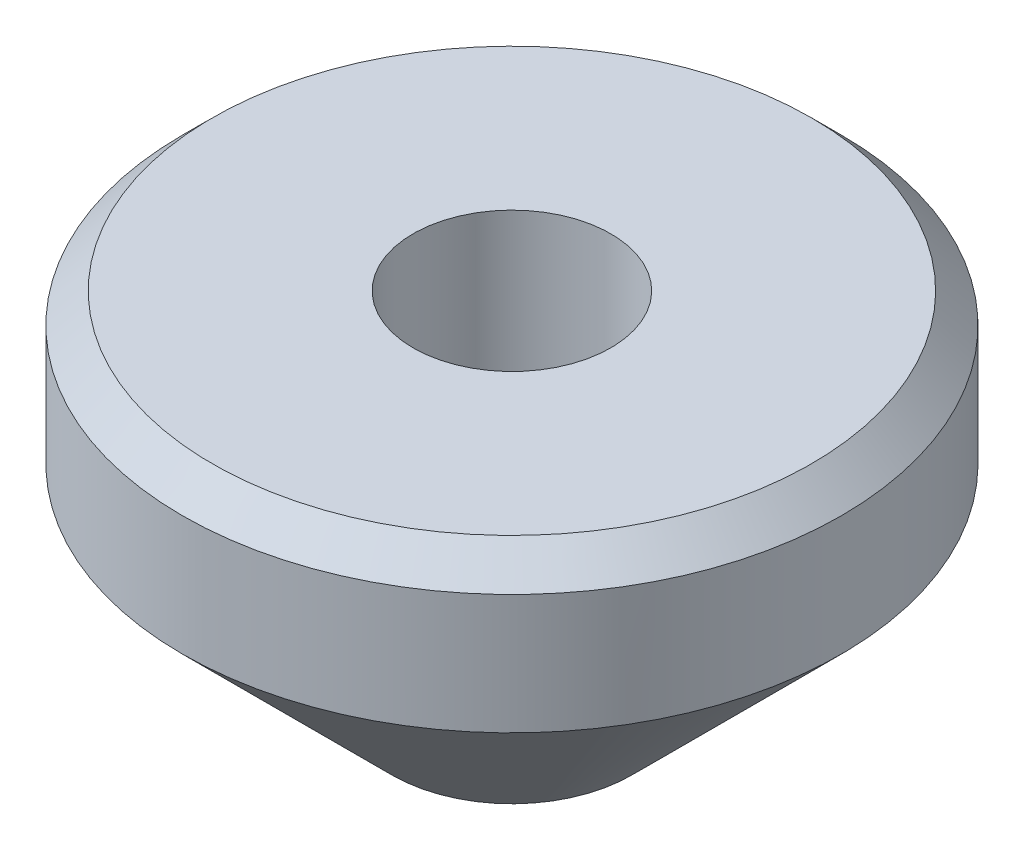
ISO-10303-21;
HEADER;
FILE_DESCRIPTION(('STEP AP214'),'2;1');
FILE_NAME('part.step','',(''),(''),'','','');
FILE_SCHEMA(('AUTOMOTIVE_DESIGN { 1 0 10303 214 1 1 1 1 }'));
ENDSEC;
DATA;
#1=APPLICATION_CONTEXT('core data for automotive mechanical design processes');
#2=APPLICATION_PROTOCOL_DEFINITION('international standard','automotive_design',2000,#1);
#3=PRODUCT_CONTEXT('',#1,'mechanical');
#4=PRODUCT('Part','Part','',(#3));
#5=PRODUCT_RELATED_PRODUCT_CATEGORY('part','',(#4));
#6=PRODUCT_DEFINITION_FORMATION('','',#4);
#7=PRODUCT_DEFINITION_CONTEXT('part definition',#1,'design');
#8=PRODUCT_DEFINITION('design','',#6,#7);
#9=PRODUCT_DEFINITION_SHAPE('','',#8);
#10=(LENGTH_UNIT() NAMED_UNIT(*) SI_UNIT(.MILLI.,.METRE.));
#11=(NAMED_UNIT(*) PLANE_ANGLE_UNIT() SI_UNIT($,.RADIAN.));
#12=(NAMED_UNIT(*) SI_UNIT($,.STERADIAN.) SOLID_ANGLE_UNIT());
#13=UNCERTAINTY_MEASURE_WITH_UNIT(LENGTH_MEASURE(1.E-05),#10,'distance_accuracy_value','');
#14=(GEOMETRIC_REPRESENTATION_CONTEXT(3) GLOBAL_UNCERTAINTY_ASSIGNED_CONTEXT((#13)) GLOBAL_UNIT_ASSIGNED_CONTEXT((#10,
#11,#12)) REPRESENTATION_CONTEXT('',''));
#15=CARTESIAN_POINT('',(0.,0.,0.));
#16=DIRECTION('',(0.,0.,1.));
#17=DIRECTION('',(1.,0.,0.));
#18=AXIS2_PLACEMENT_3D('',#15,#16,#17);
#19=CARTESIAN_POINT('',(2.,0.,0.));
#20=DIRECTION('',(0.,1.,0.));
#21=DIRECTION('',(0.,0.,1.));
#22=AXIS2_PLACEMENT_3D('',#19,#20,#21);
#23=PLANE('',#22);
#24=CARTESIAN_POINT('',(0.,0.,0.));
#25=DIRECTION('',(0.,1.,0.));
#26=DIRECTION('',(0.,0.,1.));
#27=AXIS2_PLACEMENT_3D('',#24,#25,#26);
#28=CIRCLE('',#27,1.65);
#29=CARTESIAN_POINT('',(0.,0.,1.65));
#30=VERTEX_POINT('',#29);
#31=EDGE_CURVE('E35',#30,#30,#28,.T.);
#32=ORIENTED_EDGE('',*,*,#31,.T.);
#33=EDGE_LOOP('',(#32));
#34=FACE_BOUND('',#33,.T.);
#35=CARTESIAN_POINT('',(0.,0.,0.));
#36=DIRECTION('',(0.,1.,0.));
#37=DIRECTION('',(0.,0.,1.));
#38=AXIS2_PLACEMENT_3D('',#35,#36,#37);
#39=CIRCLE('',#38,2.);
#40=CARTESIAN_POINT('',(0.,0.,2.));
#41=VERTEX_POINT('',#40);
#42=EDGE_CURVE('E30',#41,#41,#39,.T.);
#43=ORIENTED_EDGE('',*,*,#42,.F.);
#44=EDGE_LOOP('',(#43));
#45=FACE_BOUND('',#44,.T.);
#46=ADVANCED_FACE('F15',(#34,#45),#23,.F.);
#47=CARTESIAN_POINT('',(0.,6.,0.));
#48=DIRECTION('',(0.,-1.,0.));
#49=DIRECTION('',(0.,0.,-1.));
#50=AXIS2_PLACEMENT_3D('',#47,#48,#49);
#51=PLANE('',#50);
#52=CARTESIAN_POINT('',(0.,6.,0.));
#53=DIRECTION('',(0.,-1.,0.));
#54=DIRECTION('',(0.,0.,-1.));
#55=AXIS2_PLACEMENT_3D('',#52,#53,#54);
#56=CIRCLE('',#55,5.);
#57=CARTESIAN_POINT('',(0.,6.,-5.));
#58=VERTEX_POINT('',#57);
#59=EDGE_CURVE('E22',#58,#58,#56,.F.);
#60=ORIENTED_EDGE('',*,*,#59,.T.);
#61=EDGE_LOOP('',(#60));
#62=FACE_BOUND('',#61,.T.);
#63=CARTESIAN_POINT('',(0.,6.,0.));
#64=DIRECTION('',(0.,1.,0.));
#65=DIRECTION('',(0.,0.,1.));
#66=AXIS2_PLACEMENT_3D('',#63,#64,#65);
#67=CIRCLE('',#66,1.65);
#68=CARTESIAN_POINT('',(0.,6.,1.65));
#69=VERTEX_POINT('',#68);
#70=EDGE_CURVE('E36',#69,#69,#67,.T.);
#71=ORIENTED_EDGE('',*,*,#70,.F.);
#72=EDGE_LOOP('',(#71));
#73=FACE_BOUND('',#72,.T.);
#74=ADVANCED_FACE('F51',(#62,#73),#51,.F.);
#75=CARTESIAN_POINT('',(0.,0.,0.));
#76=DIRECTION('',(0.,1.,0.));
#77=DIRECTION('',(0.,0.,1.));
#78=AXIS2_PLACEMENT_3D('',#75,#76,#77);
#79=CYLINDRICAL_SURFACE('',#78,5.5);
#80=CARTESIAN_POINT('',(0.,5.5,0.));
#81=DIRECTION('',(0.,-1.,0.));
#82=DIRECTION('',(0.,0.,-1.));
#83=AXIS2_PLACEMENT_3D('',#80,#81,#82);
#84=CIRCLE('',#83,5.5);
#85=CARTESIAN_POINT('',(0.,5.5,-5.5));
#86=VERTEX_POINT('',#85);
#87=EDGE_CURVE('E10',#86,#86,#84,.T.);
#88=ORIENTED_EDGE('',*,*,#87,.T.);
#89=EDGE_LOOP('',(#88));
#90=FACE_BOUND('',#89,.T.);
#91=CARTESIAN_POINT('',(0.,3.5,0.));
#92=DIRECTION('',(0.,1.,0.));
#93=DIRECTION('',(0.,0.,1.));
#94=AXIS2_PLACEMENT_3D('',#91,#92,#93);
#95=CIRCLE('',#94,5.5);
#96=CARTESIAN_POINT('',(0.,3.5,5.5));
#97=VERTEX_POINT('',#96);
#98=EDGE_CURVE('E26',#97,#97,#95,.T.);
#99=ORIENTED_EDGE('',*,*,#98,.T.);
#100=EDGE_LOOP('',(#99));
#101=FACE_BOUND('',#100,.T.);
#102=ADVANCED_FACE('F53',(#90,#101),#79,.T.);
#103=CARTESIAN_POINT('',(0.,0.,0.));
#104=DIRECTION('',(0.,1.,0.));
#105=DIRECTION('',(0.,0.,1.));
#106=AXIS2_PLACEMENT_3D('',#103,#104,#105);
#107=CONICAL_SURFACE('',#106,2.,0.785398163397448);
#108=ORIENTED_EDGE('',*,*,#98,.F.);
#109=EDGE_LOOP('',(#108));
#110=FACE_BOUND('',#109,.T.);
#111=ORIENTED_EDGE('',*,*,#42,.T.);
#112=EDGE_LOOP('',(#111));
#113=FACE_BOUND('',#112,.T.);
#114=ADVANCED_FACE('F47',(#110,#113),#107,.T.);
#115=CARTESIAN_POINT('',(0.,0.,0.));
#116=DIRECTION('',(0.,1.,0.));
#117=DIRECTION('',(0.,0.,1.));
#118=AXIS2_PLACEMENT_3D('',#115,#116,#117);
#119=CYLINDRICAL_SURFACE('',#118,1.65);
#120=ORIENTED_EDGE('',*,*,#31,.F.);
#121=EDGE_LOOP('',(#120));
#122=FACE_BOUND('',#121,.T.);
#123=ORIENTED_EDGE('',*,*,#70,.T.);
#124=EDGE_LOOP('',(#123));
#125=FACE_BOUND('',#124,.T.);
#126=ADVANCED_FACE('F44',(#122,#125),#119,.F.);
#127=CARTESIAN_POINT('',(0.,6.,0.));
#128=DIRECTION('',(0.,-1.,0.));
#129=DIRECTION('',(0.,0.,-1.));
#130=AXIS2_PLACEMENT_3D('',#127,#128,#129);
#131=CONICAL_SURFACE('',#130,5.,0.785398163397446);
#132=ORIENTED_EDGE('',*,*,#87,.F.);
#133=EDGE_LOOP('',(#132));
#134=FACE_BOUND('',#133,.T.);
#135=ORIENTED_EDGE('',*,*,#59,.F.);
#136=EDGE_LOOP('',(#135));
#137=FACE_BOUND('',#136,.T.);
#138=ADVANCED_FACE('F17',(#134,#137),#131,.T.);
#139=CLOSED_SHELL('',(#46,#74,#102,#114,#126,#138));
#140=MANIFOLD_SOLID_BREP('B1',#139);
#141=ADVANCED_BREP_SHAPE_REPRESENTATION('',(#18,#140),#14);
#142=SHAPE_DEFINITION_REPRESENTATION(#9,#141);
ENDSEC;
END-ISO-10303-21;
